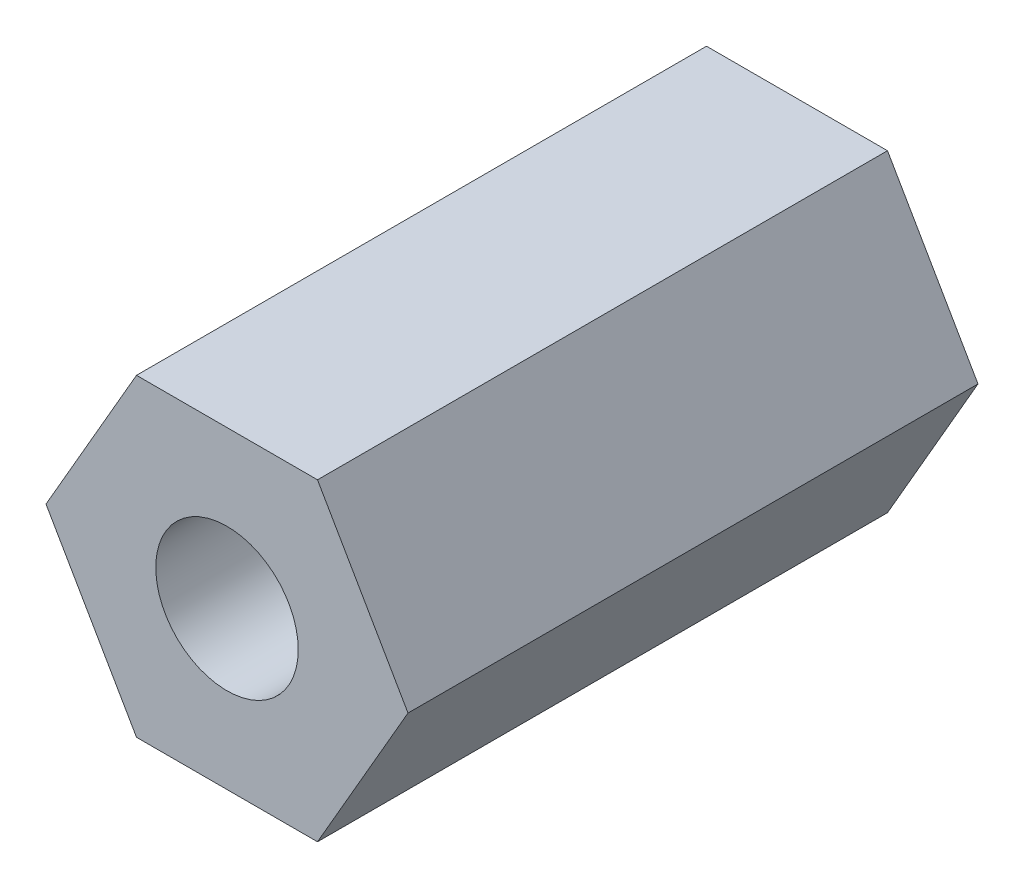
ISO-10303-21;
HEADER;
FILE_DESCRIPTION(('STEP AP214'),'2;1');
FILE_NAME('part.step','',(''),(''),'','','');
FILE_SCHEMA(('AUTOMOTIVE_DESIGN { 1 0 10303 214 1 1 1 1 }'));
ENDSEC;
DATA;
#1=APPLICATION_CONTEXT('core data for automotive mechanical design processes');
#2=APPLICATION_PROTOCOL_DEFINITION('international standard','automotive_design',2000,#1);
#3=PRODUCT_CONTEXT('',#1,'mechanical');
#4=PRODUCT('Part','Part','',(#3));
#5=PRODUCT_RELATED_PRODUCT_CATEGORY('part','',(#4));
#6=PRODUCT_DEFINITION_FORMATION('','',#4);
#7=PRODUCT_DEFINITION_CONTEXT('part definition',#1,'design');
#8=PRODUCT_DEFINITION('design','',#6,#7);
#9=PRODUCT_DEFINITION_SHAPE('','',#8);
#10=(LENGTH_UNIT() NAMED_UNIT(*) SI_UNIT(.MILLI.,.METRE.));
#11=(NAMED_UNIT(*) PLANE_ANGLE_UNIT() SI_UNIT($,.RADIAN.));
#12=(NAMED_UNIT(*) SI_UNIT($,.STERADIAN.) SOLID_ANGLE_UNIT());
#13=UNCERTAINTY_MEASURE_WITH_UNIT(LENGTH_MEASURE(1.E-05),#10,'distance_accuracy_value','');
#14=(GEOMETRIC_REPRESENTATION_CONTEXT(3) GLOBAL_UNCERTAINTY_ASSIGNED_CONTEXT((#13)) GLOBAL_UNIT_ASSIGNED_CONTEXT((#10,
#11,#12)) REPRESENTATION_CONTEXT('',''));
#15=CARTESIAN_POINT('',(0.,0.,0.));
#16=DIRECTION('',(0.,0.,1.));
#17=DIRECTION('',(1.,0.,0.));
#18=AXIS2_PLACEMENT_3D('',#15,#16,#17);
#19=CARTESIAN_POINT('',(0.,0.,10.));
#20=DIRECTION('',(0.,0.,1.));
#21=DIRECTION('',(1.,0.,0.));
#22=AXIS2_PLACEMENT_3D('',#19,#20,#21);
#23=PLANE('',#22);
#24=DIRECTION('',(0.500000000000002,0.866025403784437,0.));
#25=VECTOR('',#24,1.);
#26=CARTESIAN_POINT('',(1.58771324027146,-2.75000000000001,10.));
#27=LINE('',#26,#25);
#28=CARTESIAN_POINT('',(1.58771324027146,-2.75000000000001,10.));
#29=VERTEX_POINT('',#28);
#30=CARTESIAN_POINT('',(3.17542648054294,0.,10.));
#31=VERTEX_POINT('',#30);
#32=EDGE_CURVE('E140',#29,#31,#27,.T.);
#33=ORIENTED_EDGE('',*,*,#32,.T.);
#34=DIRECTION('',(-0.5,0.866025403784439,0.));
#35=VECTOR('',#34,1.);
#36=CARTESIAN_POINT('',(3.17542648054294,0.,10.));
#37=LINE('',#36,#35);
#38=CARTESIAN_POINT('',(1.58771324027147,2.75,10.));
#39=VERTEX_POINT('',#38);
#40=EDGE_CURVE('E92',#31,#39,#37,.T.);
#41=ORIENTED_EDGE('',*,*,#40,.T.);
#42=DIRECTION('',(-1.,0.,0.));
#43=VECTOR('',#42,1.);
#44=CARTESIAN_POINT('',(1.58771324027147,2.75,10.));
#45=LINE('',#44,#43);
#46=CARTESIAN_POINT('',(-1.58771324027146,2.75,10.));
#47=VERTEX_POINT('',#46);
#48=EDGE_CURVE('E107',#39,#47,#45,.T.);
#49=ORIENTED_EDGE('',*,*,#48,.T.);
#50=DIRECTION('',(-0.500000000000002,-0.866025403784437,0.));
#51=VECTOR('',#50,1.);
#52=CARTESIAN_POINT('',(-1.58771324027146,2.75,10.));
#53=LINE('',#52,#51);
#54=CARTESIAN_POINT('',(-3.17542648054294,0.,10.));
#55=VERTEX_POINT('',#54);
#56=EDGE_CURVE('E105',#47,#55,#53,.T.);
#57=ORIENTED_EDGE('',*,*,#56,.T.);
#58=DIRECTION('',(0.499999999999997,-0.866025403784441,0.));
#59=VECTOR('',#58,1.);
#60=CARTESIAN_POINT('',(-3.17542648054294,0.,10.));
#61=LINE('',#60,#59);
#62=CARTESIAN_POINT('',(-1.58771324027148,-2.74999999999999,10.));
#63=VERTEX_POINT('',#62);
#64=EDGE_CURVE('E106',#55,#63,#61,.T.);
#65=ORIENTED_EDGE('',*,*,#64,.T.);
#66=DIRECTION('',(1.,0.,0.));
#67=VECTOR('',#66,1.);
#68=CARTESIAN_POINT('',(-1.58771324027148,-2.74999999999999,10.));
#69=LINE('',#68,#67);
#70=EDGE_CURVE('E59',#63,#29,#69,.T.);
#71=ORIENTED_EDGE('',*,*,#70,.T.);
#72=EDGE_LOOP('',(#33,#41,#49,#57,#65,#71));
#73=FACE_BOUND('',#72,.T.);
#74=CARTESIAN_POINT('',(0.,0.,10.));
#75=DIRECTION('',(0.,0.,1.));
#76=DIRECTION('',(1.,0.,0.));
#77=AXIS2_PLACEMENT_3D('',#74,#75,#76);
#78=CIRCLE('',#77,1.25);
#79=CARTESIAN_POINT('',(1.25,0.,10.));
#80=VERTEX_POINT('',#79);
#81=EDGE_CURVE('E128',#80,#80,#78,.T.);
#82=ORIENTED_EDGE('',*,*,#81,.F.);
#83=EDGE_LOOP('',(#82));
#84=FACE_BOUND('',#83,.T.);
#85=ADVANCED_FACE('F41',(#73,#84),#23,.T.);
#86=CARTESIAN_POINT('',(0.,0.,0.));
#87=DIRECTION('',(0.,0.,1.));
#88=DIRECTION('',(1.,0.,0.));
#89=AXIS2_PLACEMENT_3D('',#86,#87,#88);
#90=PLANE('',#89);
#91=DIRECTION('',(0.500000000000002,0.866025403784437,0.));
#92=VECTOR('',#91,1.);
#93=CARTESIAN_POINT('',(1.58771324027146,-2.75000000000001,0.));
#94=LINE('',#93,#92);
#95=CARTESIAN_POINT('',(1.58771324027146,-2.75000000000001,0.));
#96=VERTEX_POINT('',#95);
#97=CARTESIAN_POINT('',(3.17542648054294,0.,0.));
#98=VERTEX_POINT('',#97);
#99=EDGE_CURVE('E127',#96,#98,#94,.T.);
#100=ORIENTED_EDGE('',*,*,#99,.F.);
#101=DIRECTION('',(1.,0.,0.));
#102=VECTOR('',#101,1.);
#103=CARTESIAN_POINT('',(-1.58771324027148,-2.74999999999999,0.));
#104=LINE('',#103,#102);
#105=CARTESIAN_POINT('',(-1.58771324027148,-2.74999999999999,0.));
#106=VERTEX_POINT('',#105);
#107=EDGE_CURVE('E87',#106,#96,#104,.T.);
#108=ORIENTED_EDGE('',*,*,#107,.F.);
#109=DIRECTION('',(0.499999999999997,-0.866025403784441,0.));
#110=VECTOR('',#109,1.);
#111=CARTESIAN_POINT('',(-3.17542648054294,0.,0.));
#112=LINE('',#111,#110);
#113=CARTESIAN_POINT('',(-3.17542648054294,0.,0.));
#114=VERTEX_POINT('',#113);
#115=EDGE_CURVE('E82',#114,#106,#112,.T.);
#116=ORIENTED_EDGE('',*,*,#115,.F.);
#117=DIRECTION('',(-0.500000000000002,-0.866025403784437,0.));
#118=VECTOR('',#117,1.);
#119=CARTESIAN_POINT('',(-1.58771324027146,2.75,0.));
#120=LINE('',#119,#118);
#121=CARTESIAN_POINT('',(-1.58771324027146,2.75,0.));
#122=VERTEX_POINT('',#121);
#123=EDGE_CURVE('E118',#122,#114,#120,.T.);
#124=ORIENTED_EDGE('',*,*,#123,.F.);
#125=DIRECTION('',(-1.,0.,0.));
#126=VECTOR('',#125,1.);
#127=CARTESIAN_POINT('',(1.58771324027147,2.75,0.));
#128=LINE('',#127,#126);
#129=CARTESIAN_POINT('',(1.58771324027147,2.75,0.));
#130=VERTEX_POINT('',#129);
#131=EDGE_CURVE('E134',#130,#122,#128,.T.);
#132=ORIENTED_EDGE('',*,*,#131,.F.);
#133=DIRECTION('',(-0.5,0.866025403784439,0.));
#134=VECTOR('',#133,1.);
#135=CARTESIAN_POINT('',(3.17542648054294,0.,0.));
#136=LINE('',#135,#134);
#137=EDGE_CURVE('E129',#98,#130,#136,.T.);
#138=ORIENTED_EDGE('',*,*,#137,.F.);
#139=EDGE_LOOP('',(#100,#108,#116,#124,#132,#138));
#140=FACE_BOUND('',#139,.T.);
#141=CARTESIAN_POINT('',(0.,0.,0.));
#142=DIRECTION('',(0.,0.,1.));
#143=DIRECTION('',(1.,0.,0.));
#144=AXIS2_PLACEMENT_3D('',#141,#142,#143);
#145=CIRCLE('',#144,1.25);
#146=CARTESIAN_POINT('',(1.25,0.,0.));
#147=VERTEX_POINT('',#146);
#148=EDGE_CURVE('E226',#147,#147,#145,.T.);
#149=ORIENTED_EDGE('',*,*,#148,.T.);
#150=EDGE_LOOP('',(#149));
#151=FACE_BOUND('',#150,.T.);
#152=ADVANCED_FACE('F148',(#140,#151),#90,.F.);
#153=CARTESIAN_POINT('',(1.58771324027146,-2.75000000000001,10.));
#154=DIRECTION('',(-0.866025403784437,0.500000000000002,0.));
#155=DIRECTION('',(-0.500000000000002,-0.866025403784437,0.));
#156=AXIS2_PLACEMENT_3D('',#153,#154,#155);
#157=PLANE('',#156);
#158=ORIENTED_EDGE('',*,*,#99,.T.);
#159=DIRECTION('',(0.,0.,-1.));
#160=VECTOR('',#159,1.);
#161=CARTESIAN_POINT('',(3.17542648054294,0.,10.));
#162=LINE('',#161,#160);
#163=EDGE_CURVE('E11',#31,#98,#162,.T.);
#164=ORIENTED_EDGE('',*,*,#163,.F.);
#165=ORIENTED_EDGE('',*,*,#32,.F.);
#166=DIRECTION('',(0.,0.,-1.));
#167=VECTOR('',#166,1.);
#168=CARTESIAN_POINT('',(1.58771324027146,-2.75000000000001,10.));
#169=LINE('',#168,#167);
#170=EDGE_CURVE('E125',#29,#96,#169,.T.);
#171=ORIENTED_EDGE('',*,*,#170,.T.);
#172=EDGE_LOOP('',(#158,#164,#165,#171));
#173=FACE_BOUND('',#172,.T.);
#174=ADVANCED_FACE('F43',(#173),#157,.F.);
#175=CARTESIAN_POINT('',(3.17542648054294,0.,10.));
#176=DIRECTION('',(-0.866025403784439,-0.5,0.));
#177=DIRECTION('',(0.5,-0.866025403784439,0.));
#178=AXIS2_PLACEMENT_3D('',#175,#176,#177);
#179=PLANE('',#178);
#180=ORIENTED_EDGE('',*,*,#137,.T.);
#181=DIRECTION('',(0.,0.,-1.));
#182=VECTOR('',#181,1.);
#183=CARTESIAN_POINT('',(1.58771324027147,2.75,10.));
#184=LINE('',#183,#182);
#185=EDGE_CURVE('E49',#39,#130,#184,.T.);
#186=ORIENTED_EDGE('',*,*,#185,.F.);
#187=ORIENTED_EDGE('',*,*,#40,.F.);
#188=ORIENTED_EDGE('',*,*,#163,.T.);
#189=EDGE_LOOP('',(#180,#186,#187,#188));
#190=FACE_BOUND('',#189,.T.);
#191=ADVANCED_FACE('F173',(#190),#179,.F.);
#192=CARTESIAN_POINT('',(1.58771324027147,2.75,10.));
#193=DIRECTION('',(0.,-1.,0.));
#194=DIRECTION('',(1.,0.,0.));
#195=AXIS2_PLACEMENT_3D('',#192,#193,#194);
#196=PLANE('',#195);
#197=ORIENTED_EDGE('',*,*,#131,.T.);
#198=DIRECTION('',(0.,0.,-1.));
#199=VECTOR('',#198,1.);
#200=CARTESIAN_POINT('',(-1.58771324027146,2.75,10.));
#201=LINE('',#200,#199);
#202=EDGE_CURVE('E119',#47,#122,#201,.T.);
#203=ORIENTED_EDGE('',*,*,#202,.F.);
#204=ORIENTED_EDGE('',*,*,#48,.F.);
#205=ORIENTED_EDGE('',*,*,#185,.T.);
#206=EDGE_LOOP('',(#197,#203,#204,#205));
#207=FACE_BOUND('',#206,.T.);
#208=ADVANCED_FACE('F141',(#207),#196,.F.);
#209=CARTESIAN_POINT('',(-1.58771324027146,2.75,10.));
#210=DIRECTION('',(0.866025403784437,-0.500000000000002,0.));
#211=DIRECTION('',(0.500000000000002,0.866025403784437,0.));
#212=AXIS2_PLACEMENT_3D('',#209,#210,#211);
#213=PLANE('',#212);
#214=ORIENTED_EDGE('',*,*,#123,.T.);
#215=DIRECTION('',(0.,0.,-1.));
#216=VECTOR('',#215,1.);
#217=CARTESIAN_POINT('',(-3.17542648054294,0.,10.));
#218=LINE('',#217,#216);
#219=EDGE_CURVE('E114',#55,#114,#218,.T.);
#220=ORIENTED_EDGE('',*,*,#219,.F.);
#221=ORIENTED_EDGE('',*,*,#56,.F.);
#222=ORIENTED_EDGE('',*,*,#202,.T.);
#223=EDGE_LOOP('',(#214,#220,#221,#222));
#224=FACE_BOUND('',#223,.T.);
#225=ADVANCED_FACE('F111',(#224),#213,.F.);
#226=CARTESIAN_POINT('',(-3.17542648054294,0.,10.));
#227=DIRECTION('',(0.86602540378444,0.499999999999997,0.));
#228=DIRECTION('',(-0.499999999999997,0.86602540378444,0.));
#229=AXIS2_PLACEMENT_3D('',#226,#227,#228);
#230=PLANE('',#229);
#231=ORIENTED_EDGE('',*,*,#115,.T.);
#232=DIRECTION('',(0.,0.,-1.));
#233=VECTOR('',#232,1.);
#234=CARTESIAN_POINT('',(-1.58771324027148,-2.74999999999999,10.));
#235=LINE('',#234,#233);
#236=EDGE_CURVE('E117',#63,#106,#235,.T.);
#237=ORIENTED_EDGE('',*,*,#236,.F.);
#238=ORIENTED_EDGE('',*,*,#64,.F.);
#239=ORIENTED_EDGE('',*,*,#219,.T.);
#240=EDGE_LOOP('',(#231,#237,#238,#239));
#241=FACE_BOUND('',#240,.T.);
#242=ADVANCED_FACE('F116',(#241),#230,.F.);
#243=CARTESIAN_POINT('',(-1.58771324027148,-2.74999999999999,10.));
#244=DIRECTION('',(0.,1.,0.));
#245=DIRECTION('',(-1.,0.,0.));
#246=AXIS2_PLACEMENT_3D('',#243,#244,#245);
#247=PLANE('',#246);
#248=ORIENTED_EDGE('',*,*,#107,.T.);
#249=ORIENTED_EDGE('',*,*,#170,.F.);
#250=ORIENTED_EDGE('',*,*,#70,.F.);
#251=ORIENTED_EDGE('',*,*,#236,.T.);
#252=EDGE_LOOP('',(#248,#249,#250,#251));
#253=FACE_BOUND('',#252,.T.);
#254=ADVANCED_FACE('F151',(#253),#247,.F.);
#255=CARTESIAN_POINT('',(0.,0.,10.));
#256=DIRECTION('',(0.,0.,-1.));
#257=DIRECTION('',(-1.,0.,0.));
#258=AXIS2_PLACEMENT_3D('',#255,#256,#257);
#259=CYLINDRICAL_SURFACE('',#258,1.25);
#260=ORIENTED_EDGE('',*,*,#81,.T.);
#261=EDGE_LOOP('',(#260));
#262=FACE_BOUND('',#261,.T.);
#263=ORIENTED_EDGE('',*,*,#148,.F.);
#264=EDGE_LOOP('',(#263));
#265=FACE_BOUND('',#264,.T.);
#266=ADVANCED_FACE('F153',(#262,#265),#259,.F.);
#267=CLOSED_SHELL('',(#85,#152,#174,#191,#208,#225,#242,#254,#266));
#268=MANIFOLD_SOLID_BREP('B2',#267);
#269=ADVANCED_BREP_SHAPE_REPRESENTATION('',(#18,#268),#14);
#270=SHAPE_DEFINITION_REPRESENTATION(#9,#269);
ENDSEC;
END-ISO-10303-21;
